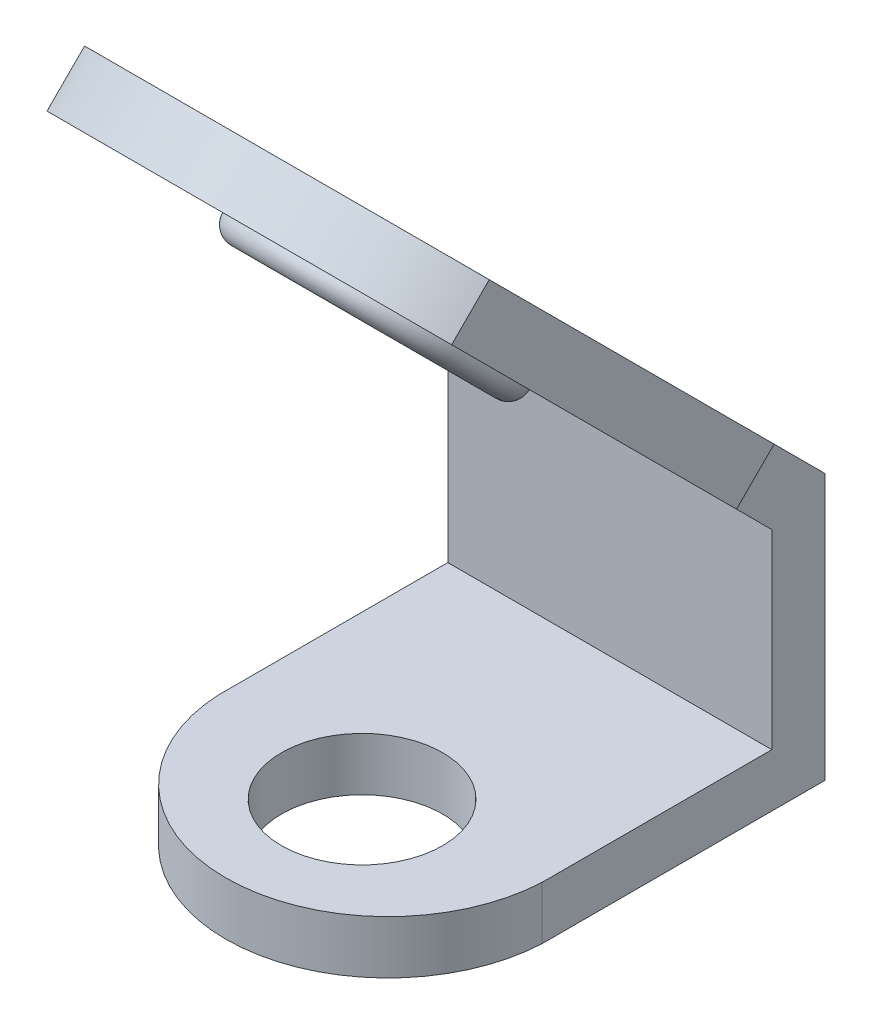
ISO-10303-21;
HEADER;
FILE_DESCRIPTION(('STEP AP214'),'2;1');
FILE_NAME('part.step','',(''),(''),'','','');
FILE_SCHEMA(('AUTOMOTIVE_DESIGN { 1 0 10303 214 1 1 1 1 }'));
ENDSEC;
DATA;
#1=APPLICATION_CONTEXT('core data for automotive mechanical design processes');
#2=APPLICATION_PROTOCOL_DEFINITION('international standard','automotive_design',2000,#1);
#3=PRODUCT_CONTEXT('',#1,'mechanical');
#4=PRODUCT('Part','Part','',(#3));
#5=PRODUCT_RELATED_PRODUCT_CATEGORY('part','',(#4));
#6=PRODUCT_DEFINITION_FORMATION('','',#4);
#7=PRODUCT_DEFINITION_CONTEXT('part definition',#1,'design');
#8=PRODUCT_DEFINITION('design','',#6,#7);
#9=PRODUCT_DEFINITION_SHAPE('','',#8);
#10=(LENGTH_UNIT() NAMED_UNIT(*) SI_UNIT(.MILLI.,.METRE.));
#11=(NAMED_UNIT(*) PLANE_ANGLE_UNIT() SI_UNIT($,.RADIAN.));
#12=(NAMED_UNIT(*) SI_UNIT($,.STERADIAN.) SOLID_ANGLE_UNIT());
#13=UNCERTAINTY_MEASURE_WITH_UNIT(LENGTH_MEASURE(1.E-05),#10,'distance_accuracy_value','');
#14=(GEOMETRIC_REPRESENTATION_CONTEXT(3) GLOBAL_UNCERTAINTY_ASSIGNED_CONTEXT((#13)) GLOBAL_UNIT_ASSIGNED_CONTEXT((#10,
#11,#12)) REPRESENTATION_CONTEXT('',''));
#15=CARTESIAN_POINT('',(0.,0.,0.));
#16=DIRECTION('',(0.,0.,1.));
#17=DIRECTION('',(1.,0.,0.));
#18=AXIS2_PLACEMENT_3D('',#15,#16,#17);
#19=CARTESIAN_POINT('',(0.,0.7874,0.));
#20=DIRECTION('',(0.,1.,0.));
#21=DIRECTION('',(0.,0.,1.));
#22=AXIS2_PLACEMENT_3D('',#19,#20,#21);
#23=CYLINDRICAL_SURFACE('',#22,1.1938);
#24=CARTESIAN_POINT('',(0.,0.,0.));
#25=DIRECTION('',(0.,1.,0.));
#26=DIRECTION('',(0.,0.,1.));
#27=AXIS2_PLACEMENT_3D('',#24,#25,#26);
#28=CIRCLE('',#27,1.1938);
#29=CARTESIAN_POINT('',(0.,0.,1.1938));
#30=VERTEX_POINT('',#29);
#31=EDGE_CURVE('E201',#30,#30,#28,.F.);
#32=ORIENTED_EDGE('',*,*,#31,.T.);
#33=EDGE_LOOP('',(#32));
#34=FACE_BOUND('',#33,.T.);
#35=CARTESIAN_POINT('',(0.,0.7874,0.));
#36=DIRECTION('',(0.,1.,0.));
#37=DIRECTION('',(0.,0.,1.));
#38=AXIS2_PLACEMENT_3D('',#35,#36,#37);
#39=CIRCLE('',#38,1.1938);
#40=CARTESIAN_POINT('',(0.,0.7874,1.1938));
#41=VERTEX_POINT('',#40);
#42=EDGE_CURVE('E362',#41,#41,#39,.F.);
#43=ORIENTED_EDGE('',*,*,#42,.F.);
#44=EDGE_LOOP('',(#43));
#45=FACE_BOUND('',#44,.T.);
#46=ADVANCED_FACE('F16',(#34,#45),#23,.F.);
#47=CARTESIAN_POINT('',(0.,0.7874,-0.3838575));
#48=DIRECTION('',(0.,1.,0.));
#49=DIRECTION('',(0.,0.,1.));
#50=AXIS2_PLACEMENT_3D('',#47,#48,#49);
#51=CYLINDRICAL_SURFACE('',#50,2.4031575);
#52=CARTESIAN_POINT('',(0.,0.7874,-0.3838575));
#53=DIRECTION('',(0.,1.,0.));
#54=DIRECTION('',(0.,0.,1.));
#55=AXIS2_PLACEMENT_3D('',#52,#53,#54);
#56=CIRCLE('',#55,2.4031575);
#57=CARTESIAN_POINT('',(-2.4003,0.7874,-0.266700000000001));
#58=VERTEX_POINT('',#57);
#59=CARTESIAN_POINT('',(2.4003,0.7874,-0.266699999999999));
#60=VERTEX_POINT('',#59);
#61=EDGE_CURVE('E106',#58,#60,#56,.T.);
#62=ORIENTED_EDGE('',*,*,#61,.F.);
#63=DIRECTION('',(0.,1.,0.));
#64=VECTOR('',#63,1.);
#65=CARTESIAN_POINT('',(-2.4003,0.7874,-0.266700000000009));
#66=LINE('',#65,#64);
#67=CARTESIAN_POINT('',(-2.4003,0.,-0.266700000000001));
#68=VERTEX_POINT('',#67);
#69=EDGE_CURVE('E64',#58,#68,#66,.F.);
#70=ORIENTED_EDGE('',*,*,#69,.T.);
#71=CARTESIAN_POINT('',(0.,0.,-0.3838575));
#72=DIRECTION('',(0.,1.,0.));
#73=DIRECTION('',(0.,0.,1.));
#74=AXIS2_PLACEMENT_3D('',#71,#72,#73);
#75=CIRCLE('',#74,2.4031575);
#76=CARTESIAN_POINT('',(2.4003,0.,-0.266699999999999));
#77=VERTEX_POINT('',#76);
#78=EDGE_CURVE('E19',#68,#77,#75,.T.);
#79=ORIENTED_EDGE('',*,*,#78,.T.);
#80=DIRECTION('',(0.,1.,0.));
#81=VECTOR('',#80,1.);
#82=CARTESIAN_POINT('',(2.4003,0.7874,-0.266700000000005));
#83=LINE('',#82,#81);
#84=EDGE_CURVE('E129',#77,#60,#83,.T.);
#85=ORIENTED_EDGE('',*,*,#84,.T.);
#86=EDGE_LOOP('',(#62,#70,#79,#85));
#87=FACE_BOUND('',#86,.T.);
#88=ADVANCED_FACE('F136',(#87),#51,.T.);
#89=CARTESIAN_POINT('',(0.,7.07488549132548,-0.206262749661932));
#90=DIRECTION('',(0.,0.707106781186544,-0.707106781186551));
#91=DIRECTION('',(0.,0.707106781186551,0.707106781186544));
#92=AXIS2_PLACEMENT_3D('',#89,#90,#91);
#93=TOROIDAL_SURFACE('',#92,1.6002,0.254000000000003);
#94=CARTESIAN_POINT('',(0.,7.07488549132548,-0.206262749661929));
#95=DIRECTION('',(0.,0.707106781186544,-0.707106781186551));
#96=DIRECTION('',(0.,0.707106781186551,0.707106781186544));
#97=AXIS2_PLACEMENT_3D('',#94,#95,#96);
#98=CIRCLE('',#97,1.8542);
#99=CARTESIAN_POINT('',(0.,8.38600288500158,1.10485464401416));
#100=VERTEX_POINT('',#99);
#101=EDGE_CURVE('E105',#100,#100,#98,.F.);
#102=ORIENTED_EDGE('',*,*,#101,.T.);
#103=EDGE_LOOP('',(#102));
#104=FACE_BOUND('',#103,.T.);
#105=CARTESIAN_POINT('',(0.,6.8952803689041,-0.0266576272405461));
#106=DIRECTION('',(0.,-0.707106781186544,0.707106781186551));
#107=DIRECTION('',(0.,-0.707106781186551,-0.707106781186544));
#108=AXIS2_PLACEMENT_3D('',#105,#106,#107);
#109=CIRCLE('',#108,1.6002);
#110=CARTESIAN_POINT('',(0.,5.76376809764938,-1.15816989849525));
#111=VERTEX_POINT('',#110);
#112=EDGE_CURVE('E255',#111,#111,#109,.F.);
#113=ORIENTED_EDGE('',*,*,#112,.T.);
#114=EDGE_LOOP('',(#113));
#115=FACE_BOUND('',#114,.T.);
#116=ADVANCED_FACE('F132',(#104,#115),#93,.T.);
#117=CARTESIAN_POINT('',(0.,0.,-0.3838575));
#118=DIRECTION('',(0.,1.,0.));
#119=DIRECTION('',(0.,0.,1.));
#120=AXIS2_PLACEMENT_3D('',#117,#118,#119);
#121=PLANE('',#120);
#122=ORIENTED_EDGE('',*,*,#31,.F.);
#123=EDGE_LOOP('',(#122));
#124=FACE_BOUND('',#123,.T.);
#125=DIRECTION('',(0.,0.,1.));
#126=VECTOR('',#125,1.);
#127=CARTESIAN_POINT('',(2.4003,0.,-0.266700000000008));
#128=LINE('',#127,#126);
#129=CARTESIAN_POINT('',(2.4003,0.,-4.4577));
#130=VERTEX_POINT('',#129);
#131=EDGE_CURVE('E205',#130,#77,#128,.T.);
#132=ORIENTED_EDGE('',*,*,#131,.T.);
#133=ORIENTED_EDGE('',*,*,#78,.F.);
#134=DIRECTION('',(0.,0.,-1.));
#135=VECTOR('',#134,1.);
#136=CARTESIAN_POINT('',(-2.4003,0.,-4.4577));
#137=LINE('',#136,#135);
#138=CARTESIAN_POINT('',(-2.4003,0.,-4.4577));
#139=VERTEX_POINT('',#138);
#140=EDGE_CURVE('E114',#68,#139,#137,.T.);
#141=ORIENTED_EDGE('',*,*,#140,.T.);
#142=DIRECTION('',(1.,0.,0.));
#143=VECTOR('',#142,1.);
#144=CARTESIAN_POINT('',(2.4003,0.,-4.4577));
#145=LINE('',#144,#143);
#146=EDGE_CURVE('E207',#139,#130,#145,.T.);
#147=ORIENTED_EDGE('',*,*,#146,.T.);
#148=EDGE_LOOP('',(#132,#133,#141,#147));
#149=FACE_BOUND('',#148,.T.);
#150=ADVANCED_FACE('F135',(#124,#149),#121,.F.);
#151=CARTESIAN_POINT('',(0.,0.7874,-0.3838575));
#152=DIRECTION('',(0.,1.,0.));
#153=DIRECTION('',(0.,0.,1.));
#154=AXIS2_PLACEMENT_3D('',#151,#152,#153);
#155=PLANE('',#154);
#156=DIRECTION('',(0.,0.,-1.));
#157=VECTOR('',#156,1.);
#158=CARTESIAN_POINT('',(-2.4003,0.7874,-4.4577));
#159=LINE('',#158,#157);
#160=CARTESIAN_POINT('',(-2.4003,0.7874,-3.6703));
#161=VERTEX_POINT('',#160);
#162=EDGE_CURVE('E98',#161,#58,#159,.F.);
#163=ORIENTED_EDGE('',*,*,#162,.T.);
#164=ORIENTED_EDGE('',*,*,#61,.T.);
#165=DIRECTION('',(0.,0.,1.));
#166=VECTOR('',#165,1.);
#167=CARTESIAN_POINT('',(2.4003,0.7874,-0.266700000000008));
#168=LINE('',#167,#166);
#169=CARTESIAN_POINT('',(2.4003,0.7874,-3.6703));
#170=VERTEX_POINT('',#169);
#171=EDGE_CURVE('E100',#60,#170,#168,.F.);
#172=ORIENTED_EDGE('',*,*,#171,.T.);
#173=DIRECTION('',(-1.,0.,0.));
#174=VECTOR('',#173,1.);
#175=CARTESIAN_POINT('',(2.4003,0.7874,-3.6703));
#176=LINE('',#175,#174);
#177=EDGE_CURVE('E93',#170,#161,#176,.T.);
#178=ORIENTED_EDGE('',*,*,#177,.T.);
#179=EDGE_LOOP('',(#163,#164,#172,#178));
#180=FACE_BOUND('',#179,.T.);
#181=ORIENTED_EDGE('',*,*,#42,.T.);
#182=EDGE_LOOP('',(#181));
#183=FACE_BOUND('',#182,.T.);
#184=ADVANCED_FACE('F95',(#180,#183),#155,.T.);
#185=CARTESIAN_POINT('',(2.4003,3.61084824098742,-3.6703));
#186=DIRECTION('',(0.,0.,-1.));
#187=DIRECTION('',(-1.,0.,0.));
#188=AXIS2_PLACEMENT_3D('',#185,#186,#187);
#189=PLANE('',#188);
#190=DIRECTION('',(0.,1.,0.));
#191=VECTOR('',#190,1.);
#192=CARTESIAN_POINT('',(2.4003,0.7874,-3.6703));
#193=LINE('',#192,#191);
#194=CARTESIAN_POINT('',(2.4003,3.61084824098742,-3.6703));
#195=VERTEX_POINT('',#194);
#196=EDGE_CURVE('E213',#170,#195,#193,.T.);
#197=ORIENTED_EDGE('',*,*,#196,.T.);
#198=DIRECTION('',(1.,0.,0.));
#199=VECTOR('',#198,1.);
#200=CARTESIAN_POINT('',(2.4003,3.61084824098742,-3.6703));
#201=LINE('',#200,#199);
#202=CARTESIAN_POINT('',(-2.4003,3.61084824098742,-3.6703));
#203=VERTEX_POINT('',#202);
#204=EDGE_CURVE('E117',#195,#203,#201,.F.);
#205=ORIENTED_EDGE('',*,*,#204,.T.);
#206=DIRECTION('',(0.,1.,0.));
#207=VECTOR('',#206,1.);
#208=CARTESIAN_POINT('',(-2.4003,0.7874,-3.6703));
#209=LINE('',#208,#207);
#210=EDGE_CURVE('E111',#203,#161,#209,.F.);
#211=ORIENTED_EDGE('',*,*,#210,.T.);
#212=ORIENTED_EDGE('',*,*,#177,.F.);
#213=EDGE_LOOP('',(#197,#205,#211,#212));
#214=FACE_BOUND('',#213,.T.);
#215=ADVANCED_FACE('F116',(#214),#189,.F.);
#216=CARTESIAN_POINT('',(2.4003,9.83182412049371,2.55067587950629));
#217=DIRECTION('',(0.,0.707106781186547,-0.707106781186548));
#218=DIRECTION('',(0.,0.707106781186548,0.707106781186547));
#219=AXIS2_PLACEMENT_3D('',#216,#217,#218);
#220=PLANE('',#219);
#221=CARTESIAN_POINT('',(0.,6.83958020347134,-0.441568037516088));
#222=DIRECTION('',(0.,0.707106781186547,-0.707106781186548));
#223=DIRECTION('',(0.,0.707106781186548,0.707106781186547));
#224=AXIS2_PLACEMENT_3D('',#221,#222,#223);
#225=CIRCLE('',#224,4.23117346938775);
#226=CARTESIAN_POINT('',(-2.9972,8.95140655618725,1.67025831519982));
#227=VERTEX_POINT('',#226);
#228=CARTESIAN_POINT('',(2.9972,8.95140655618725,1.67025831519982));
#229=VERTEX_POINT('',#228);
#230=EDGE_CURVE('E302',#227,#229,#225,.T.);
#231=ORIENTED_EDGE('',*,*,#230,.F.);
#232=DIRECTION('',(0.,0.707106781186548,0.707106781186547));
#233=VECTOR('',#232,1.);
#234=CARTESIAN_POINT('',(-2.9972,4.73068617928474,-2.55046206170268));
#235=LINE('',#234,#233);
#236=CARTESIAN_POINT('',(-2.9972,4.73068617928474,-2.55046206170268));
#237=VERTEX_POINT('',#236);
#238=EDGE_CURVE('E230',#237,#227,#235,.T.);
#239=ORIENTED_EDGE('',*,*,#238,.F.);
#240=DIRECTION('',(1.,0.,0.));
#241=VECTOR('',#240,1.);
#242=CARTESIAN_POINT('',(-2.9972,4.73068617928474,-2.55046206170268));
#243=LINE('',#242,#241);
#244=CARTESIAN_POINT('',(-2.4003,4.73068617928474,-2.55046206170268));
#245=VERTEX_POINT('',#244);
#246=EDGE_CURVE('E73',#245,#237,#243,.F.);
#247=ORIENTED_EDGE('',*,*,#246,.F.);
#248=DIRECTION('',(0.,-0.707106781186548,-0.707106781186547));
#249=VECTOR('',#248,1.);
#250=CARTESIAN_POINT('',(-2.4003,4.73068617928474,-2.55046206170268));
#251=LINE('',#250,#249);
#252=EDGE_CURVE('E233',#245,#203,#251,.T.);
#253=ORIENTED_EDGE('',*,*,#252,.T.);
#254=ORIENTED_EDGE('',*,*,#204,.F.);
#255=DIRECTION('',(0.,0.707106781186548,0.707106781186547));
#256=VECTOR('',#255,1.);
#257=CARTESIAN_POINT('',(2.4003,3.61084824098742,-3.6703));
#258=LINE('',#257,#256);
#259=CARTESIAN_POINT('',(2.4003,4.73068617928474,-2.55046206170268));
#260=VERTEX_POINT('',#259);
#261=EDGE_CURVE('E275',#195,#260,#258,.T.);
#262=ORIENTED_EDGE('',*,*,#261,.T.);
#263=DIRECTION('',(1.,0.,0.));
#264=VECTOR('',#263,1.);
#265=CARTESIAN_POINT('',(-2.9972,4.73068617928474,-2.55046206170268));
#266=LINE('',#265,#264);
#267=CARTESIAN_POINT('',(2.9972,4.73068617928474,-2.55046206170268));
#268=VERTEX_POINT('',#267);
#269=EDGE_CURVE('E267',#268,#260,#266,.F.);
#270=ORIENTED_EDGE('',*,*,#269,.F.);
#271=DIRECTION('',(0.,-0.707106781186548,-0.707106781186547));
#272=VECTOR('',#271,1.);
#273=CARTESIAN_POINT('',(2.9972,8.95140655618725,1.67025831519982));
#274=LINE('',#273,#272);
#275=EDGE_CURVE('E263',#229,#268,#274,.T.);
#276=ORIENTED_EDGE('',*,*,#275,.F.);
#277=EDGE_LOOP('',(#231,#239,#247,#253,#254,#262,#270,#276));
#278=FACE_BOUND('',#277,.T.);
#279=ORIENTED_EDGE('',*,*,#101,.F.);
#280=EDGE_LOOP('',(#279));
#281=FACE_BOUND('',#280,.T.);
#282=ADVANCED_FACE('F186',(#278,#281),#220,.F.);
#283=CARTESIAN_POINT('',(0.,7.63166137083177,-0.763038629168229));
#284=DIRECTION('',(0.,-0.707106781186544,0.707106781186551));
#285=DIRECTION('',(0.,-0.707106781186551,-0.707106781186544));
#286=AXIS2_PLACEMENT_3D('',#283,#284,#285);
#287=CYLINDRICAL_SURFACE('',#286,1.6002);
#288=ORIENTED_EDGE('',*,*,#112,.F.);
#289=EDGE_LOOP('',(#288));
#290=FACE_BOUND('',#289,.T.);
#291=CARTESIAN_POINT('',(0.,7.63166137083176,-0.763038629168218));
#292=DIRECTION('',(0.,-0.707106781186544,0.707106781186551));
#293=DIRECTION('',(0.,-0.707106781186551,-0.707106781186544));
#294=AXIS2_PLACEMENT_3D('',#291,#292,#293);
#295=CIRCLE('',#294,1.6002);
#296=CARTESIAN_POINT('',(0.,6.50014909957704,-1.89455090042293));
#297=VERTEX_POINT('',#296);
#298=EDGE_CURVE('E344',#297,#297,#295,.F.);
#299=ORIENTED_EDGE('',*,*,#298,.T.);
#300=EDGE_LOOP('',(#299));
#301=FACE_BOUND('',#300,.T.);
#302=ADVANCED_FACE('F182',(#290,#301),#287,.F.);
#303=CARTESIAN_POINT('',(-2.9972,9.50818243569354,1.11348243569353));
#304=DIRECTION('',(-1.,0.,0.));
#305=DIRECTION('',(0.,0.,1.));
#306=AXIS2_PLACEMENT_3D('',#303,#304,#305);
#307=PLANE('',#306);
#308=DIRECTION('',(0.,-0.707106781186547,-0.707106781186548));
#309=VECTOR('',#308,1.);
#310=CARTESIAN_POINT('',(-2.9972,3.937,-4.4577));
#311=LINE('',#310,#309);
#312=CARTESIAN_POINT('',(-2.9972,9.50818243569353,1.11348243569353));
#313=VERTEX_POINT('',#312);
#314=CARTESIAN_POINT('',(-2.9972,5.28746205879103,-3.10723794120897));
#315=VERTEX_POINT('',#314);
#316=EDGE_CURVE('E250',#313,#315,#311,.T.);
#317=ORIENTED_EDGE('',*,*,#316,.T.);
#318=DIRECTION('',(0.,0.707106781186547,-0.707106781186548));
#319=VECTOR('',#318,1.);
#320=CARTESIAN_POINT('',(-2.9972,5.28746205879103,-3.10723794120897));
#321=LINE('',#320,#319);
#322=EDGE_CURVE('E118',#237,#315,#321,.T.);
#323=ORIENTED_EDGE('',*,*,#322,.F.);
#324=ORIENTED_EDGE('',*,*,#238,.T.);
#325=DIRECTION('',(0.,0.707106781186547,-0.707106781186548));
#326=VECTOR('',#325,1.);
#327=CARTESIAN_POINT('',(-2.9972,9.50818243569354,1.11348243569353));
#328=LINE('',#327,#326);
#329=EDGE_CURVE('E307',#313,#227,#328,.F.);
#330=ORIENTED_EDGE('',*,*,#329,.F.);
#331=EDGE_LOOP('',(#317,#323,#324,#330));
#332=FACE_BOUND('',#331,.T.);
#333=ADVANCED_FACE('F178',(#332),#307,.T.);
#334=CARTESIAN_POINT('',(-2.9972,5.28746205879103,-3.10723794120897));
#335=DIRECTION('',(0.,-0.707106781186548,-0.707106781186547));
#336=DIRECTION('',(0.,0.707106781186547,-0.707106781186548));
#337=AXIS2_PLACEMENT_3D('',#334,#335,#336);
#338=PLANE('',#337);
#339=ORIENTED_EDGE('',*,*,#322,.T.);
#340=DIRECTION('',(1.,0.,0.));
#341=VECTOR('',#340,1.);
#342=CARTESIAN_POINT('',(2.4003,5.28746205879103,-3.10723794120897));
#343=LINE('',#342,#341);
#344=CARTESIAN_POINT('',(-2.4003,5.28746205879103,-3.10723794120897));
#345=VERTEX_POINT('',#344);
#346=EDGE_CURVE('E247',#315,#345,#343,.T.);
#347=ORIENTED_EDGE('',*,*,#346,.T.);
#348=DIRECTION('',(0.,-0.707106781186547,0.707106781186547));
#349=VECTOR('',#348,1.);
#350=CARTESIAN_POINT('',(-2.4003,5.28746205879103,-3.10723794120897));
#351=LINE('',#350,#349);
#352=EDGE_CURVE('E226',#345,#245,#351,.T.);
#353=ORIENTED_EDGE('',*,*,#352,.T.);
#354=ORIENTED_EDGE('',*,*,#246,.T.);
#355=EDGE_LOOP('',(#339,#347,#353,#354));
#356=FACE_BOUND('',#355,.T.);
#357=ADVANCED_FACE('F175',(#356),#338,.T.);
#358=CARTESIAN_POINT('',(-2.4003,0.7874,-4.4577));
#359=DIRECTION('',(1.,0.,0.));
#360=DIRECTION('',(0.,0.,-1.));
#361=AXIS2_PLACEMENT_3D('',#358,#359,#360);
#362=PLANE('',#361);
#363=ORIENTED_EDGE('',*,*,#352,.F.);
#364=DIRECTION('',(0.,-0.707106781186547,-0.707106781186548));
#365=VECTOR('',#364,1.);
#366=CARTESIAN_POINT('',(-2.4003,3.937,-4.4577));
#367=LINE('',#366,#365);
#368=CARTESIAN_POINT('',(-2.4003,3.937,-4.4577));
#369=VERTEX_POINT('',#368);
#370=EDGE_CURVE('E249',#345,#369,#367,.T.);
#371=ORIENTED_EDGE('',*,*,#370,.T.);
#372=DIRECTION('',(0.,1.,0.));
#373=VECTOR('',#372,1.);
#374=CARTESIAN_POINT('',(-2.4003,0.7874,-4.4577));
#375=LINE('',#374,#373);
#376=EDGE_CURVE('E222',#369,#139,#375,.F.);
#377=ORIENTED_EDGE('',*,*,#376,.T.);
#378=ORIENTED_EDGE('',*,*,#140,.F.);
#379=ORIENTED_EDGE('',*,*,#69,.F.);
#380=ORIENTED_EDGE('',*,*,#162,.F.);
#381=ORIENTED_EDGE('',*,*,#210,.F.);
#382=ORIENTED_EDGE('',*,*,#252,.F.);
#383=EDGE_LOOP('',(#363,#371,#377,#378,#379,#380,#381,#382));
#384=FACE_BOUND('',#383,.T.);
#385=ADVANCED_FACE('F110',(#384),#362,.F.);
#386=CARTESIAN_POINT('',(2.4003,0.7874,-4.4577));
#387=DIRECTION('',(0.,0.,1.));
#388=DIRECTION('',(1.,0.,0.));
#389=AXIS2_PLACEMENT_3D('',#386,#387,#388);
#390=PLANE('',#389);
#391=ORIENTED_EDGE('',*,*,#376,.F.);
#392=DIRECTION('',(1.,0.,0.));
#393=VECTOR('',#392,1.);
#394=CARTESIAN_POINT('',(2.4003,3.937,-4.4577));
#395=LINE('',#394,#393);
#396=CARTESIAN_POINT('',(2.4003,3.937,-4.4577));
#397=VERTEX_POINT('',#396);
#398=EDGE_CURVE('E319',#369,#397,#395,.T.);
#399=ORIENTED_EDGE('',*,*,#398,.T.);
#400=DIRECTION('',(0.,1.,0.));
#401=VECTOR('',#400,1.);
#402=CARTESIAN_POINT('',(2.4003,0.7874,-4.4577));
#403=LINE('',#402,#401);
#404=EDGE_CURVE('E211',#397,#130,#403,.F.);
#405=ORIENTED_EDGE('',*,*,#404,.T.);
#406=ORIENTED_EDGE('',*,*,#146,.F.);
#407=EDGE_LOOP('',(#391,#399,#405,#406));
#408=FACE_BOUND('',#407,.T.);
#409=ADVANCED_FACE('F168',(#408),#390,.F.);
#410=CARTESIAN_POINT('',(2.4003,0.7874,-0.266700000000008));
#411=DIRECTION('',(-1.,0.,0.));
#412=DIRECTION('',(0.,0.,1.));
#413=AXIS2_PLACEMENT_3D('',#410,#411,#412);
#414=PLANE('',#413);
#415=DIRECTION('',(0.,0.707106781186547,-0.707106781186548));
#416=VECTOR('',#415,1.);
#417=CARTESIAN_POINT('',(2.4003,5.28746205879103,-3.10723794120897));
#418=LINE('',#417,#416);
#419=CARTESIAN_POINT('',(2.4003,5.28746205879103,-3.10723794120897));
#420=VERTEX_POINT('',#419);
#421=EDGE_CURVE('E272',#260,#420,#418,.T.);
#422=ORIENTED_EDGE('',*,*,#421,.F.);
#423=ORIENTED_EDGE('',*,*,#261,.F.);
#424=ORIENTED_EDGE('',*,*,#196,.F.);
#425=ORIENTED_EDGE('',*,*,#171,.F.);
#426=ORIENTED_EDGE('',*,*,#84,.F.);
#427=ORIENTED_EDGE('',*,*,#131,.F.);
#428=ORIENTED_EDGE('',*,*,#404,.F.);
#429=DIRECTION('',(0.,-0.707106781186547,-0.707106781186548));
#430=VECTOR('',#429,1.);
#431=CARTESIAN_POINT('',(2.4003,3.937,-4.4577));
#432=LINE('',#431,#430);
#433=EDGE_CURVE('E312',#397,#420,#432,.F.);
#434=ORIENTED_EDGE('',*,*,#433,.T.);
#435=EDGE_LOOP('',(#422,#423,#424,#425,#426,#427,#428,#434));
#436=FACE_BOUND('',#435,.T.);
#437=ADVANCED_FACE('F164',(#436),#414,.F.);
#438=CARTESIAN_POINT('',(-2.9972,5.28746205879103,-3.10723794120897));
#439=DIRECTION('',(0.,-0.707106781186548,-0.707106781186547));
#440=DIRECTION('',(0.,0.707106781186547,-0.707106781186548));
#441=AXIS2_PLACEMENT_3D('',#438,#439,#440);
#442=PLANE('',#441);
#443=DIRECTION('',(0.,0.707106781186547,-0.707106781186547));
#444=VECTOR('',#443,1.);
#445=CARTESIAN_POINT('',(2.9972,4.73068617928474,-2.55046206170268));
#446=LINE('',#445,#444);
#447=CARTESIAN_POINT('',(2.9972,5.28746205879103,-3.10723794120897));
#448=VERTEX_POINT('',#447);
#449=EDGE_CURVE('E266',#268,#448,#446,.T.);
#450=ORIENTED_EDGE('',*,*,#449,.F.);
#451=ORIENTED_EDGE('',*,*,#269,.T.);
#452=ORIENTED_EDGE('',*,*,#421,.T.);
#453=DIRECTION('',(1.,0.,0.));
#454=VECTOR('',#453,1.);
#455=CARTESIAN_POINT('',(2.4003,5.28746205879103,-3.10723794120897));
#456=LINE('',#455,#454);
#457=EDGE_CURVE('E299',#420,#448,#456,.T.);
#458=ORIENTED_EDGE('',*,*,#457,.T.);
#459=EDGE_LOOP('',(#450,#451,#452,#458));
#460=FACE_BOUND('',#459,.T.);
#461=ADVANCED_FACE('F160',(#460),#442,.T.);
#462=CARTESIAN_POINT('',(2.9972,5.28746205879103,-3.10723794120897));
#463=DIRECTION('',(1.,0.,0.));
#464=DIRECTION('',(0.,0.,-1.));
#465=AXIS2_PLACEMENT_3D('',#462,#463,#464);
#466=PLANE('',#465);
#467=DIRECTION('',(0.,-0.707106781186547,-0.707106781186548));
#468=VECTOR('',#467,1.);
#469=CARTESIAN_POINT('',(2.9972,3.937,-4.4577));
#470=LINE('',#469,#468);
#471=CARTESIAN_POINT('',(2.9972,9.50818243569353,1.11348243569353));
#472=VERTEX_POINT('',#471);
#473=EDGE_CURVE('E25',#448,#472,#470,.F.);
#474=ORIENTED_EDGE('',*,*,#473,.T.);
#475=DIRECTION('',(0.,0.707106781186547,-0.707106781186548));
#476=VECTOR('',#475,1.);
#477=CARTESIAN_POINT('',(2.9972,9.50818243569354,1.11348243569353));
#478=LINE('',#477,#476);
#479=EDGE_CURVE('E33',#229,#472,#478,.T.);
#480=ORIENTED_EDGE('',*,*,#479,.F.);
#481=ORIENTED_EDGE('',*,*,#275,.T.);
#482=ORIENTED_EDGE('',*,*,#449,.T.);
#483=EDGE_LOOP('',(#474,#480,#481,#482));
#484=FACE_BOUND('',#483,.T.);
#485=ADVANCED_FACE('F153',(#484),#466,.T.);
#486=CARTESIAN_POINT('',(0.,7.39635608297763,-0.998343917022379));
#487=DIRECTION('',(0.,0.707106781186547,-0.707106781186548));
#488=DIRECTION('',(0.,0.707106781186548,0.707106781186547));
#489=AXIS2_PLACEMENT_3D('',#486,#487,#488);
#490=CYLINDRICAL_SURFACE('',#489,4.23117346938775);
#491=CARTESIAN_POINT('',(0.,7.39635608297763,-0.998343917022377));
#492=DIRECTION('',(0.,0.707106781186547,-0.707106781186548));
#493=DIRECTION('',(0.,0.707106781186548,0.707106781186547));
#494=AXIS2_PLACEMENT_3D('',#491,#492,#493);
#495=CIRCLE('',#494,4.23117346938775);
#496=EDGE_CURVE('E10',#472,#313,#495,.F.);
#497=ORIENTED_EDGE('',*,*,#496,.T.);
#498=ORIENTED_EDGE('',*,*,#329,.T.);
#499=ORIENTED_EDGE('',*,*,#230,.T.);
#500=ORIENTED_EDGE('',*,*,#479,.T.);
#501=EDGE_LOOP('',(#497,#498,#499,#500));
#502=FACE_BOUND('',#501,.T.);
#503=ADVANCED_FACE('F147',(#502),#490,.T.);
#504=CARTESIAN_POINT('',(2.4003,3.937,-4.4577));
#505=DIRECTION('',(0.,-0.707106781186548,0.707106781186547));
#506=DIRECTION('',(0.,-0.707106781186547,-0.707106781186548));
#507=AXIS2_PLACEMENT_3D('',#504,#505,#506);
#508=PLANE('',#507);
#509=ORIENTED_EDGE('',*,*,#473,.F.);
#510=ORIENTED_EDGE('',*,*,#457,.F.);
#511=ORIENTED_EDGE('',*,*,#433,.F.);
#512=ORIENTED_EDGE('',*,*,#398,.F.);
#513=ORIENTED_EDGE('',*,*,#370,.F.);
#514=ORIENTED_EDGE('',*,*,#346,.F.);
#515=ORIENTED_EDGE('',*,*,#316,.F.);
#516=ORIENTED_EDGE('',*,*,#496,.F.);
#517=EDGE_LOOP('',(#509,#510,#511,#512,#513,#514,#515,#516));
#518=FACE_BOUND('',#517,.T.);
#519=ORIENTED_EDGE('',*,*,#298,.F.);
#520=EDGE_LOOP('',(#519));
#521=FACE_BOUND('',#520,.T.);
#522=ADVANCED_FACE('F145',(#518,#521),#508,.F.);
#523=CLOSED_SHELL('',(#46,#88,#116,#150,#184,#215,#282,#302,#333,#357,#385,#409,#437,#461,#485,
#503,#522));
#524=MANIFOLD_SOLID_BREP('B1',#523);
#525=ADVANCED_BREP_SHAPE_REPRESENTATION('',(#18,#524),#14);
#526=SHAPE_DEFINITION_REPRESENTATION(#9,#525);
ENDSEC;
END-ISO-10303-21;
